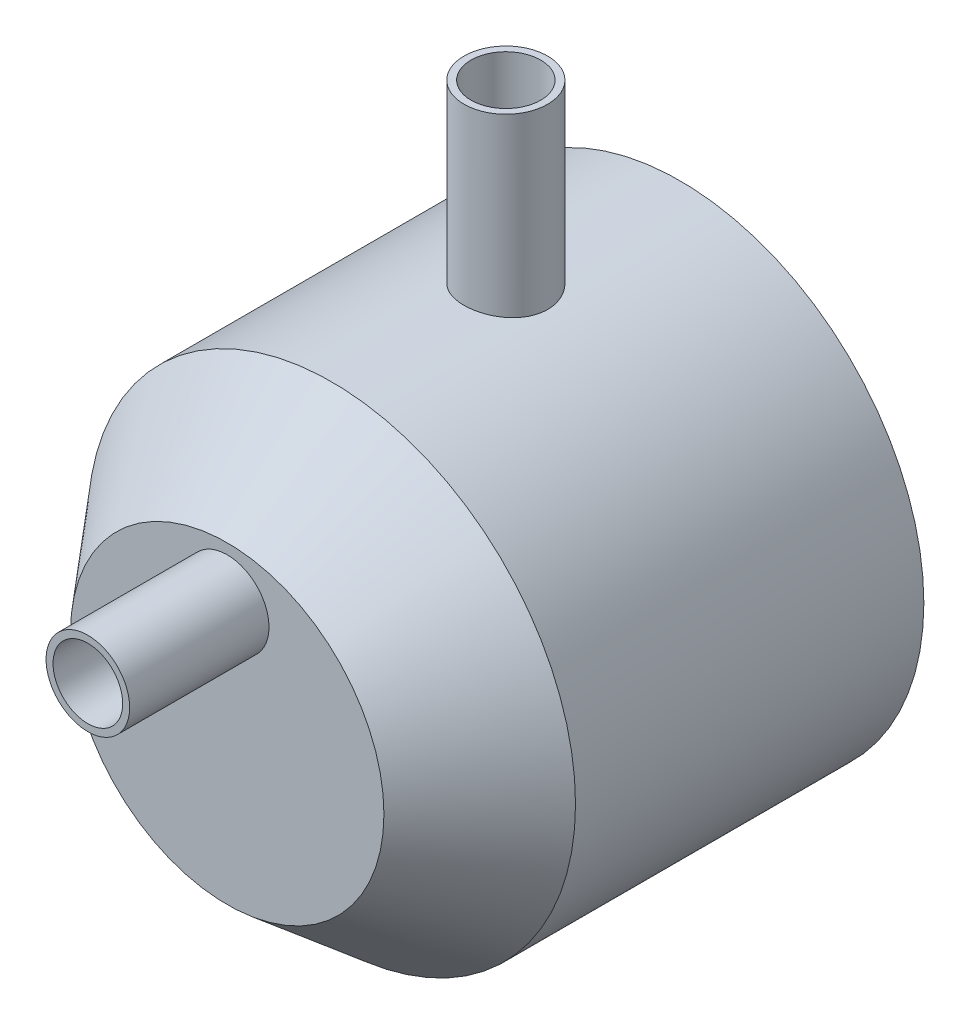
ISO-10303-21;
HEADER;
FILE_DESCRIPTION(('STEP AP214'),'2;1');
FILE_NAME('part.step','',(''),(''),'','','');
FILE_SCHEMA(('AUTOMOTIVE_DESIGN { 1 0 10303 214 1 1 1 1 }'));
ENDSEC;
DATA;
#1=APPLICATION_CONTEXT('core data for automotive mechanical design processes');
#2=APPLICATION_PROTOCOL_DEFINITION('international standard','automotive_design',2000,#1);
#3=PRODUCT_CONTEXT('',#1,'mechanical');
#4=PRODUCT('Part','Part','',(#3));
#5=PRODUCT_RELATED_PRODUCT_CATEGORY('part','',(#4));
#6=PRODUCT_DEFINITION_FORMATION('','',#4);
#7=PRODUCT_DEFINITION_CONTEXT('part definition',#1,'design');
#8=PRODUCT_DEFINITION('design','',#6,#7);
#9=PRODUCT_DEFINITION_SHAPE('','',#8);
#10=(LENGTH_UNIT() NAMED_UNIT(*) SI_UNIT(.MILLI.,.METRE.));
#11=(NAMED_UNIT(*) PLANE_ANGLE_UNIT() SI_UNIT($,.RADIAN.));
#12=(NAMED_UNIT(*) SI_UNIT($,.STERADIAN.) SOLID_ANGLE_UNIT());
#13=UNCERTAINTY_MEASURE_WITH_UNIT(LENGTH_MEASURE(1.E-05),#10,'distance_accuracy_value','');
#14=(GEOMETRIC_REPRESENTATION_CONTEXT(3) GLOBAL_UNCERTAINTY_ASSIGNED_CONTEXT((#13)) GLOBAL_UNIT_ASSIGNED_CONTEXT((#10,
#11,#12)) REPRESENTATION_CONTEXT('',''));
#15=CARTESIAN_POINT('',(0.,0.,0.));
#16=DIRECTION('',(0.,0.,1.));
#17=DIRECTION('',(1.,0.,0.));
#18=AXIS2_PLACEMENT_3D('',#15,#16,#17);
#19=CARTESIAN_POINT('',(0.,0.,-25.));
#20=DIRECTION('',(0.,0.,1.));
#21=DIRECTION('',(1.,0.,0.));
#22=AXIS2_PLACEMENT_3D('',#19,#20,#21);
#23=PLANE('',#22);
#24=CARTESIAN_POINT('',(0.,28.75,-25.));
#25=DIRECTION('',(0.,0.,-1.));
#26=DIRECTION('',(-1.,0.,0.));
#27=AXIS2_PLACEMENT_3D('',#24,#25,#26);
#28=CIRCLE('',#27,1.5);
#29=CARTESIAN_POINT('',(-1.5,28.75,-25.));
#30=VERTEX_POINT('',#29);
#31=EDGE_CURVE('E246',#30,#30,#28,.T.);
#32=ORIENTED_EDGE('',*,*,#31,.F.);
#33=EDGE_LOOP('',(#32));
#34=FACE_BOUND('',#33,.T.);
#35=CARTESIAN_POINT('',(-28.75,-1.0038008849174E-13,-25.));
#36=DIRECTION('',(0.,0.,-1.));
#37=DIRECTION('',(-1.,0.,0.));
#38=AXIS2_PLACEMENT_3D('',#35,#36,#37);
#39=CIRCLE('',#38,1.5);
#40=CARTESIAN_POINT('',(-30.25,-1.0038008849174E-13,-25.));
#41=VERTEX_POINT('',#40);
#42=EDGE_CURVE('E240',#41,#41,#39,.T.);
#43=ORIENTED_EDGE('',*,*,#42,.F.);
#44=EDGE_LOOP('',(#43));
#45=FACE_BOUND('',#44,.T.);
#46=CARTESIAN_POINT('',(2.0076017698348E-13,-28.75,-25.));
#47=DIRECTION('',(0.,0.,-1.));
#48=DIRECTION('',(-1.,0.,0.));
#49=AXIS2_PLACEMENT_3D('',#46,#47,#48);
#50=CIRCLE('',#49,1.5);
#51=CARTESIAN_POINT('',(-1.4999999999998,-28.75,-25.));
#52=VERTEX_POINT('',#51);
#53=EDGE_CURVE('E234',#52,#52,#50,.T.);
#54=ORIENTED_EDGE('',*,*,#53,.F.);
#55=EDGE_LOOP('',(#54));
#56=FACE_BOUND('',#55,.T.);
#57=CARTESIAN_POINT('',(28.75,0.,-25.));
#58=DIRECTION('',(0.,0.,-1.));
#59=DIRECTION('',(-1.,0.,0.));
#60=AXIS2_PLACEMENT_3D('',#57,#58,#59);
#61=CIRCLE('',#60,1.50000000000029);
#62=CARTESIAN_POINT('',(27.2499999999997,0.,-25.));
#63=VERTEX_POINT('',#62);
#64=EDGE_CURVE('E228',#63,#63,#61,.T.);
#65=ORIENTED_EDGE('',*,*,#64,.F.);
#66=EDGE_LOOP('',(#65));
#67=FACE_BOUND('',#66,.T.);
#68=CARTESIAN_POINT('',(0.,0.,-25.));
#69=DIRECTION('',(0.,0.,1.));
#70=DIRECTION('',(1.,0.,0.));
#71=AXIS2_PLACEMENT_3D('',#68,#69,#70);
#72=CIRCLE('',#71,35.);
#73=CARTESIAN_POINT('',(35.,0.,-25.));
#74=VERTEX_POINT('',#73);
#75=EDGE_CURVE('E57',#74,#74,#72,.T.);
#76=ORIENTED_EDGE('',*,*,#75,.F.);
#77=EDGE_LOOP('',(#76));
#78=FACE_BOUND('',#77,.T.);
#79=CARTESIAN_POINT('',(0.,0.,-25.));
#80=DIRECTION('',(0.,0.,1.));
#81=DIRECTION('',(1.,0.,0.));
#82=AXIS2_PLACEMENT_3D('',#79,#80,#81);
#83=CIRCLE('',#82,25.);
#84=CARTESIAN_POINT('',(25.,0.,-25.));
#85=VERTEX_POINT('',#84);
#86=EDGE_CURVE('E224',#85,#85,#83,.T.);
#87=ORIENTED_EDGE('',*,*,#86,.T.);
#88=EDGE_LOOP('',(#87));
#89=FACE_BOUND('',#88,.T.);
#90=ADVANCED_FACE('F41',(#34,#45,#56,#67,#78,#89),#23,.F.);
#91=CARTESIAN_POINT('',(0.,0.,25.));
#92=DIRECTION('',(0.,0.,-1.));
#93=DIRECTION('',(-1.,0.,0.));
#94=AXIS2_PLACEMENT_3D('',#91,#92,#93);
#95=CYLINDRICAL_SURFACE('',#94,35.);
#96=CARTESIAN_POINT('',(0.,35.,6.));
#97=CARTESIAN_POINT('',(0.167255087471428,35.0000011902094,6.00000267119796));
#98=CARTESIAN_POINT('',(0.334474390584254,34.9987988996139,5.99300431247895));
#99=CARTESIAN_POINT('',(0.667761983511847,34.9940258915101,5.96506920485906));
#100=CARTESIAN_POINT('',(0.83383004354154,34.9904547141925,5.94412974993866));
#101=CARTESIAN_POINT('',(1.16367070121942,34.9810394161034,5.88845199675508));
#102=CARTESIAN_POINT('',(1.32744182099786,34.9751938957832,5.85370520167074));
#103=CARTESIAN_POINT('',(1.6514864091043,34.9613915699314,5.77066517278663));
#104=CARTESIAN_POINT('',(1.81175857044868,34.9534339895959,5.72236696731272));
#105=CARTESIAN_POINT('',(2.12742268084538,34.9356413448036,5.61266065102139));
#106=CARTESIAN_POINT('',(2.28282033245156,34.9258085773321,5.55126856859272));
#107=CARTESIAN_POINT('',(2.58792139207819,34.904527774849,5.41576726871657));
#108=CARTESIAN_POINT('',(2.73762267652667,34.8930791448,5.34165336430708));
#109=CARTESIAN_POINT('',(3.03017581285948,34.8688911584513,5.18129777081694));
#110=CARTESIAN_POINT('',(3.1730309814093,34.8561524366543,5.09506203556884));
#111=CARTESIAN_POINT('',(3.45105732212438,34.8297245697617,4.91100882922026));
#112=CARTESIAN_POINT('',(3.58622560796193,34.8160350718917,4.81318704965451));
#113=CARTESIAN_POINT('',(3.84904873968708,34.7879640713622,4.6057671097983));
#114=CARTESIAN_POINT('',(3.97662830563843,34.7735775990623,4.49607422398153));
#115=CARTESIAN_POINT('',(4.22216337106758,34.7446201267743,4.26633497931929));
#116=CARTESIAN_POINT('',(4.34011528953941,34.7300490604333,4.14628480191984));
#117=CARTESIAN_POINT('',(4.56549997194578,34.701140018335,3.89672563057276));
#118=CARTESIAN_POINT('',(4.67293590168903,34.6868019735181,3.76721950393765));
#119=CARTESIAN_POINT('',(4.87662179925916,34.6587526621056,3.49955059841634));
#120=CARTESIAN_POINT('',(4.97286762693305,34.6450416286249,3.36138464445166));
#121=CARTESIAN_POINT('',(5.15400759981013,34.6185591911399,3.07650314557424));
#122=CARTESIAN_POINT('',(5.23882786309838,34.60579412236,2.9297400123547));
#123=CARTESIAN_POINT('',(5.39582022456368,34.5816632673698,2.62942000147356));
#124=CARTESIAN_POINT('',(5.46798759523201,34.5702980046398,2.47586061124641));
#125=CARTESIAN_POINT('',(5.59906873495057,34.5493103878907,2.16313326719432));
#126=CARTESIAN_POINT('',(5.65798814494934,34.5396872924026,2.00396773397012));
#127=CARTESIAN_POINT('',(5.76217911459162,34.5224570396302,1.68110754367073));
#128=CARTESIAN_POINT('',(5.80744569543277,34.5148506178921,1.51741125805874));
#129=CARTESIAN_POINT('',(5.92138281112091,34.4955569237882,1.02462432028316));
#130=CARTESIAN_POINT('',(5.96962059436966,34.4871581539253,0.690410413643021));
#131=CARTESIAN_POINT('',(6.00940841614288,34.4802462047373,0.0187185886917149));
#132=CARTESIAN_POINT('',(6.00096269894606,34.4817322852663,-0.318759083349711));
#133=CARTESIAN_POINT('',(5.928142047883,34.4943248712133,-0.983728795102239));
#134=CARTESIAN_POINT('',(5.86437937461099,34.5053260572642,-1.3112896584949));
#135=CARTESIAN_POINT('',(5.68367618630603,34.5355488861116,-1.95098144684875));
#136=CARTESIAN_POINT('',(5.56673375127239,34.5547708257084,-2.26311181425658));
#137=CARTESIAN_POINT('',(5.28237988920625,34.5993811298225,-2.86492251090354));
#138=CARTESIAN_POINT('',(5.11471569302312,34.6248002515789,-3.15448104851771));
#139=CARTESIAN_POINT('',(4.73385555217443,34.6789200271994,-3.70158520204602));
#140=CARTESIAN_POINT('',(4.52065572477878,34.7076209607999,-3.95912808508634));
#141=CARTESIAN_POINT('',(4.05144742166874,34.7655325140833,-4.43843504047085));
#142=CARTESIAN_POINT('',(3.79491383202591,34.7947448793596,-4.65968517595035));
#143=CARTESIAN_POINT('',(3.24809177643702,34.8500400800064,-5.05607892159695));
#144=CARTESIAN_POINT('',(2.95780306898345,34.8761228929832,-5.2312222018544));
#145=CARTESIAN_POINT('',(2.35121626632627,34.9222604233032,-5.53048369307316));
#146=CARTESIAN_POINT('',(2.03489445505043,34.9423095648186,-5.65455474594029));
#147=CARTESIAN_POINT('',(1.38548169006878,34.9740764048676,-5.84766360662485));
#148=CARTESIAN_POINT('',(1.05239222433856,34.9857948412842,-5.91670628858489));
#149=CARTESIAN_POINT('',(0.383327241736948,34.999480233491,-5.99709776981965));
#150=CARTESIAN_POINT('',(0.047438816180659,35.0015663808641,-6.00915180132078));
#151=CARTESIAN_POINT('',(-0.621557180969552,34.9960792088544,-5.97710650158018));
#152=CARTESIAN_POINT('',(-0.954664865430544,34.9885062834599,-5.93300946070997));
#153=CARTESIAN_POINT('',(-1.60645253609048,34.9646257483422,-5.79050034100857));
#154=CARTESIAN_POINT('',(-1.92521147659127,34.9483745778773,-5.69243909577543));
#155=CARTESIAN_POINT('',(-2.54176506024792,34.9089523152303,-5.44516031439114));
#156=CARTESIAN_POINT('',(-2.83955846889818,34.8857808159814,-5.29593976887759));
#157=CARTESIAN_POINT('',(-3.40877939224365,34.8347920653134,-4.94897524031828));
#158=CARTESIAN_POINT('',(-3.67993589975609,34.8069336061326,-4.75079282625198));
#159=CARTESIAN_POINT('',(-4.18539502869112,34.7497811627948,-4.31212995771306));
#160=CARTESIAN_POINT('',(-4.41969480526196,34.7204870680543,-4.07164624117151));
#161=CARTESIAN_POINT('',(-4.84741854940676,34.6633771820772,-3.55204207077538));
#162=CARTESIAN_POINT('',(-5.0403649495852,34.6355811775457,-3.27252601330165));
#163=CARTESIAN_POINT('',(-5.37656320247135,34.5849909667226,-2.6846216160189));
#164=CARTESIAN_POINT('',(-5.51981669519885,34.5621965953707,-2.37623422947977));
#165=CARTESIAN_POINT('',(-5.75186205052635,34.5243379675097,-1.74071365071897));
#166=CARTESIAN_POINT('',(-5.84088747754122,34.5092406059138,-1.41366758338266));
#167=CARTESIAN_POINT('',(-5.96266101932707,34.4884132879114,-0.748794651745602));
#168=CARTESIAN_POINT('',(-5.99541433952048,34.4826824650603,-0.41096878756952));
#169=CARTESIAN_POINT('',(-6.00159891647544,34.4815984876319,0.0937174166359943));
#170=CARTESIAN_POINT('',(-5.9966630087259,34.4824611974773,0.260578316821595));
#171=CARTESIAN_POINT('',(-5.97292151716282,34.4865829183128,0.593263774500498));
#172=CARTESIAN_POINT('',(-5.95412115115363,34.4898410278075,0.759088698206944));
#173=CARTESIAN_POINT('',(-5.90278019779035,34.4986644685933,1.08858292214529));
#174=CARTESIAN_POINT('',(-5.87023471601847,34.5042306217294,1.25225143308437));
#175=CARTESIAN_POINT('',(-5.79166976313164,34.5175049687505,1.57617285020332));
#176=CARTESIAN_POINT('',(-5.74565513610598,34.5252123924911,1.73642696215924));
#177=CARTESIAN_POINT('',(-5.64054285218009,34.5425405417209,2.05230572742614));
#178=CARTESIAN_POINT('',(-5.58145776436293,34.5521594281728,2.2079346664875));
#179=CARTESIAN_POINT('',(-5.45063686203589,34.5730377734228,2.51359984654499));
#180=CARTESIAN_POINT('',(-5.37890557151232,34.5842966452917,2.66363806436288));
#181=CARTESIAN_POINT('',(-5.22326103117158,34.6081455971321,2.9572215970771));
#182=CARTESIAN_POINT('',(-5.13934296703916,34.6207362026609,3.10076431643319));
#183=CARTESIAN_POINT('',(-4.95996627162299,34.6468893731251,3.38028134802724));
#184=CARTESIAN_POINT('',(-4.86451168420885,34.6604515968065,3.51625828801254));
#185=CARTESIAN_POINT('',(-4.66138804509833,34.688356871547,3.78149745816822));
#186=CARTESIAN_POINT('',(-4.55357712344585,34.702707746692,3.91065024352494));
#187=CARTESIAN_POINT('',(-4.327549159864,34.7316180291512,4.15939287551297));
#188=CARTESIAN_POINT('',(-4.20933583990684,34.7461773603313,4.27898611355196));
#189=CARTESIAN_POINT('',(-3.96320522431521,34.7751112681018,4.5079116645694));
#190=CARTESIAN_POINT('',(-3.83528218948524,34.7894857294573,4.61723782214721));
#191=CARTESIAN_POINT('',(-3.57071599823459,34.817634530251,4.82475300855758));
#192=CARTESIAN_POINT('',(-3.43407607698941,34.8314090891792,4.92294613214544));
#193=CARTESIAN_POINT('',(-3.15187580995356,34.858082506455,5.10826712540411));
#194=CARTESIAN_POINT('',(-3.00625457426991,34.8709737566258,5.19530340909114));
#195=CARTESIAN_POINT('',(-2.70813322394742,34.8953918653276,5.35674720177555));
#196=CARTESIAN_POINT('',(-2.55563566697777,34.9069192254737,5.43115935810344));
#197=CARTESIAN_POINT('',(-2.24488730323672,34.9282794883191,5.56679405306316));
#198=CARTESIAN_POINT('',(-2.08664050995266,34.938113546582,5.6280255937646));
#199=CARTESIAN_POINT('',(-1.76548316359966,34.9558142525876,5.73688281762534));
#200=CARTESIAN_POINT('',(-1.60257360589892,34.963681316788,5.78451138115076));
#201=CARTESIAN_POINT('',(-1.20307991059687,34.9801044005818,5.88311436717536));
#202=CARTESIAN_POINT('',(-0.964634829229578,34.9875299049284,5.92689342639257));
#203=CARTESIAN_POINT('',(-0.484101478526038,34.997476797315,5.985334035788));
#204=CARTESIAN_POINT('',(-0.242013277953379,34.9999982778014,5.99999613485375));
#205=CARTESIAN_POINT('',(0.,35.,6.));
#206=B_SPLINE_CURVE_WITH_KNOTS('',3,(#96,#97,#98,#99,#100,#101,#102,#103,#104,#105,#106,#107,
#108,#109,#110,#111,#112,#113,#114,#115,#116,#117,#118,#119,#120,#121,#122,#123,#124,#125,#126,
#127,#128,#129,#130,#131,#132,#133,#134,#135,#136,#137,#138,#139,#140,#141,#142,#143,#144,#145,
#146,#147,#148,#149,#150,#151,#152,#153,#154,#155,#156,#157,#158,#159,#160,#161,#162,#163,#164,
#165,#166,#167,#168,#169,#170,#171,#172,#173,#174,#175,#176,#177,#178,#179,#180,#181,#182,#183,
#184,#185,#186,#187,#188,#189,#190,#191,#192,#193,#194,#195,#196,#197,#198,#199,#200,#201,#202,
#203,#204,#205),.UNSPECIFIED.,.T.,.F.,(4,2,2,2,2,2,2,2,2,2,2,2,2,2,2,2,2,2,2,2,2,2,2,2,2,2,2,2,
2,2,2,2,2,2,2,2,2,2,2,2,2,2,2,2,2,2,2,2,2,2,2,2,2,2,4),(0.,0.501553083053311,1.00320354785158,
1.50516319976709,2.00730724948681,2.50884011017756,3.01055814329274,3.51203060502584,
4.01369013669868,4.51969793483492,5.02589309308951,5.5319353909816,6.03816432434856,
6.54752387800066,7.05707334030693,7.56640542511763,8.07592302504638,9.08394479611769,
10.0918910905938,11.0888215148139,12.0857879350411,13.0878068985843,14.0899113363684,
15.1051677868531,16.1204315016331,17.1366305796115,18.1527396376645,19.1562408828585,
20.1597011970972,21.1567135634395,22.1537845874734,23.16012987886,24.1665528087079,
25.1840372778368,26.2014881636331,27.214525239611,28.2274686000663,28.7277890689093,
29.2279213412229,29.7282318530616,30.2283626521353,30.7280145799376,31.227488126233,
31.7271595261716,32.2266562827379,32.7326061770832,33.2383757732468,33.7444466820717,
34.2503308488655,34.7601329066642,35.2697468814403,35.7790116889688,36.2881685819984,
37.0139150797248,37.7396478961815),.UNSPECIFIED.);
#207=CARTESIAN_POINT('',(0.,35.,6.));
#208=VERTEX_POINT('',#207);
#209=EDGE_CURVE('E90',#208,#208,#206,.T.);
#210=ORIENTED_EDGE('',*,*,#209,.F.);
#211=EDGE_LOOP('',(#210));
#212=FACE_BOUND('',#211,.T.);
#213=CARTESIAN_POINT('',(0.,0.,25.));
#214=DIRECTION('',(0.,0.,-1.));
#215=DIRECTION('',(-1.,0.,0.));
#216=AXIS2_PLACEMENT_3D('',#213,#214,#215);
#217=CIRCLE('',#216,35.);
#218=CARTESIAN_POINT('',(-35.,0.,25.));
#219=VERTEX_POINT('',#218);
#220=EDGE_CURVE('E53',#219,#219,#217,.F.);
#221=ORIENTED_EDGE('',*,*,#220,.F.);
#222=EDGE_LOOP('',(#221));
#223=FACE_BOUND('',#222,.T.);
#224=ORIENTED_EDGE('',*,*,#75,.T.);
#225=EDGE_LOOP('',(#224));
#226=FACE_BOUND('',#225,.T.);
#227=ADVANCED_FACE('F43',(#212,#223,#226),#95,.T.);
#228=CARTESIAN_POINT('',(0.,0.,25.));
#229=DIRECTION('',(0.,0.,-1.));
#230=DIRECTION('',(-1.,0.,0.));
#231=AXIS2_PLACEMENT_3D('',#228,#229,#230);
#232=CYLINDRICAL_SURFACE('',#231,25.);
#233=CARTESIAN_POINT('',(0.,0.,25.));
#234=DIRECTION('',(0.,0.,-1.));
#235=DIRECTION('',(-1.,0.,0.));
#236=AXIS2_PLACEMENT_3D('',#233,#234,#235);
#237=CIRCLE('',#236,25.);
#238=CARTESIAN_POINT('',(-12.9148276581861,21.4057755421137,25.));
#239=VERTEX_POINT('',#238);
#240=EDGE_CURVE('E64',#239,#239,#237,.T.);
#241=ORIENTED_EDGE('',*,*,#240,.F.);
#242=EDGE_LOOP('',(#241));
#243=FACE_BOUND('',#242,.T.);
#244=ORIENTED_EDGE('',*,*,#86,.F.);
#245=EDGE_LOOP('',(#244));
#246=FACE_BOUND('',#245,.T.);
#247=ADVANCED_FACE('F205',(#243,#246),#232,.F.);
#248=CARTESIAN_POINT('',(28.75,0.,-15.));
#249=DIRECTION('',(0.,0.,-1.));
#250=DIRECTION('',(-1.,0.,0.));
#251=AXIS2_PLACEMENT_3D('',#248,#249,#250);
#252=CYLINDRICAL_SURFACE('',#251,1.50000000000029);
#253=CARTESIAN_POINT('',(28.75,0.,-15.));
#254=DIRECTION('',(0.,0.,-1.));
#255=DIRECTION('',(-1.,0.,0.));
#256=AXIS2_PLACEMENT_3D('',#253,#254,#255);
#257=CIRCLE('',#256,1.50000000000029);
#258=CARTESIAN_POINT('',(27.2499999999997,0.,-15.));
#259=VERTEX_POINT('',#258);
#260=EDGE_CURVE('E231',#259,#259,#257,.T.);
#261=ORIENTED_EDGE('',*,*,#260,.F.);
#262=EDGE_LOOP('',(#261));
#263=FACE_BOUND('',#262,.T.);
#264=ORIENTED_EDGE('',*,*,#64,.T.);
#265=EDGE_LOOP('',(#264));
#266=FACE_BOUND('',#265,.T.);
#267=ADVANCED_FACE('F201',(#263,#266),#252,.F.);
#268=CARTESIAN_POINT('',(28.75,0.,-15.));
#269=DIRECTION('',(0.,0.,-1.));
#270=DIRECTION('',(-1.,0.,0.));
#271=AXIS2_PLACEMENT_3D('',#268,#269,#270);
#272=PLANE('',#271);
#273=ORIENTED_EDGE('',*,*,#260,.T.);
#274=EDGE_LOOP('',(#273));
#275=FACE_BOUND('',#274,.T.);
#276=ADVANCED_FACE('F197',(#275),#272,.T.);
#277=CARTESIAN_POINT('',(2.0076017698348E-13,-28.75,-15.));
#278=DIRECTION('',(0.,0.,-1.));
#279=DIRECTION('',(-1.,0.,0.));
#280=AXIS2_PLACEMENT_3D('',#277,#278,#279);
#281=CYLINDRICAL_SURFACE('',#280,1.5);
#282=CARTESIAN_POINT('',(2.0076017698348E-13,-28.75,-15.));
#283=DIRECTION('',(0.,0.,-1.));
#284=DIRECTION('',(-1.,0.,0.));
#285=AXIS2_PLACEMENT_3D('',#282,#283,#284);
#286=CIRCLE('',#285,1.5);
#287=CARTESIAN_POINT('',(-1.4999999999998,-28.75,-15.));
#288=VERTEX_POINT('',#287);
#289=EDGE_CURVE('E237',#288,#288,#286,.T.);
#290=ORIENTED_EDGE('',*,*,#289,.F.);
#291=EDGE_LOOP('',(#290));
#292=FACE_BOUND('',#291,.T.);
#293=ORIENTED_EDGE('',*,*,#53,.T.);
#294=EDGE_LOOP('',(#293));
#295=FACE_BOUND('',#294,.T.);
#296=ADVANCED_FACE('F193',(#292,#295),#281,.F.);
#297=CARTESIAN_POINT('',(2.0076017698348E-13,-28.75,-15.));
#298=DIRECTION('',(0.,0.,-1.));
#299=DIRECTION('',(-1.,0.,0.));
#300=AXIS2_PLACEMENT_3D('',#297,#298,#299);
#301=PLANE('',#300);
#302=ORIENTED_EDGE('',*,*,#289,.T.);
#303=EDGE_LOOP('',(#302));
#304=FACE_BOUND('',#303,.T.);
#305=ADVANCED_FACE('F189',(#304),#301,.T.);
#306=CARTESIAN_POINT('',(-28.75,-1.0038008849174E-13,-15.));
#307=DIRECTION('',(0.,0.,-1.));
#308=DIRECTION('',(-1.,0.,0.));
#309=AXIS2_PLACEMENT_3D('',#306,#307,#308);
#310=CYLINDRICAL_SURFACE('',#309,1.5);
#311=CARTESIAN_POINT('',(-28.75,-1.0038008849174E-13,-15.));
#312=DIRECTION('',(0.,0.,-1.));
#313=DIRECTION('',(-1.,0.,0.));
#314=AXIS2_PLACEMENT_3D('',#311,#312,#313);
#315=CIRCLE('',#314,1.5);
#316=CARTESIAN_POINT('',(-30.25,-1.0038008849174E-13,-15.));
#317=VERTEX_POINT('',#316);
#318=EDGE_CURVE('E243',#317,#317,#315,.T.);
#319=ORIENTED_EDGE('',*,*,#318,.F.);
#320=EDGE_LOOP('',(#319));
#321=FACE_BOUND('',#320,.T.);
#322=ORIENTED_EDGE('',*,*,#42,.T.);
#323=EDGE_LOOP('',(#322));
#324=FACE_BOUND('',#323,.T.);
#325=ADVANCED_FACE('F185',(#321,#324),#310,.F.);
#326=CARTESIAN_POINT('',(-28.75,-1.0038008849174E-13,-15.));
#327=DIRECTION('',(0.,0.,-1.));
#328=DIRECTION('',(-1.,0.,0.));
#329=AXIS2_PLACEMENT_3D('',#326,#327,#328);
#330=PLANE('',#329);
#331=ORIENTED_EDGE('',*,*,#318,.T.);
#332=EDGE_LOOP('',(#331));
#333=FACE_BOUND('',#332,.T.);
#334=ADVANCED_FACE('F181',(#333),#330,.T.);
#335=CARTESIAN_POINT('',(0.,28.75,-15.));
#336=DIRECTION('',(0.,0.,-1.));
#337=DIRECTION('',(-1.,0.,0.));
#338=AXIS2_PLACEMENT_3D('',#335,#336,#337);
#339=CYLINDRICAL_SURFACE('',#338,1.5);
#340=CARTESIAN_POINT('',(0.,28.75,-15.));
#341=DIRECTION('',(0.,0.,-1.));
#342=DIRECTION('',(-1.,0.,0.));
#343=AXIS2_PLACEMENT_3D('',#340,#341,#342);
#344=CIRCLE('',#343,1.5);
#345=CARTESIAN_POINT('',(-1.5,28.75,-15.));
#346=VERTEX_POINT('',#345);
#347=EDGE_CURVE('E227',#346,#346,#344,.T.);
#348=ORIENTED_EDGE('',*,*,#347,.F.);
#349=EDGE_LOOP('',(#348));
#350=FACE_BOUND('',#349,.T.);
#351=ORIENTED_EDGE('',*,*,#31,.T.);
#352=EDGE_LOOP('',(#351));
#353=FACE_BOUND('',#352,.T.);
#354=ADVANCED_FACE('F177',(#350,#353),#339,.F.);
#355=CARTESIAN_POINT('',(0.,28.75,-15.));
#356=DIRECTION('',(0.,0.,-1.));
#357=DIRECTION('',(-1.,0.,0.));
#358=AXIS2_PLACEMENT_3D('',#355,#356,#357);
#359=PLANE('',#358);
#360=ORIENTED_EDGE('',*,*,#347,.T.);
#361=EDGE_LOOP('',(#360));
#362=FACE_BOUND('',#361,.T.);
#363=ADVANCED_FACE('F174',(#362),#359,.T.);
#364=CARTESIAN_POINT('',(0.,0.,40.));
#365=DIRECTION('',(0.,0.,1.));
#366=DIRECTION('',(1.,0.,0.));
#367=AXIS2_PLACEMENT_3D('',#364,#365,#366);
#368=PLANE('',#367);
#369=CARTESIAN_POINT('',(0.,15.,40.));
#370=DIRECTION('',(0.,0.,1.));
#371=DIRECTION('',(1.,0.,0.));
#372=AXIS2_PLACEMENT_3D('',#369,#370,#371);
#373=CIRCLE('',#372,6.);
#374=CARTESIAN_POINT('',(6.,15.,40.));
#375=VERTEX_POINT('',#374);
#376=EDGE_CURVE('E11',#375,#375,#373,.T.);
#377=ORIENTED_EDGE('',*,*,#376,.F.);
#378=EDGE_LOOP('',(#377));
#379=FACE_BOUND('',#378,.T.);
#380=CARTESIAN_POINT('',(0.,0.,40.));
#381=DIRECTION('',(0.,0.,1.));
#382=DIRECTION('',(1.,0.,0.));
#383=AXIS2_PLACEMENT_3D('',#380,#381,#382);
#384=CIRCLE('',#383,22.5);
#385=CARTESIAN_POINT('',(22.5,0.,40.));
#386=VERTEX_POINT('',#385);
#387=EDGE_CURVE('E160',#386,#386,#384,.T.);
#388=ORIENTED_EDGE('',*,*,#387,.T.);
#389=EDGE_LOOP('',(#388));
#390=FACE_BOUND('',#389,.T.);
#391=ADVANCED_FACE('F125',(#379,#390),#368,.T.);
#392=CARTESIAN_POINT('',(0.,0.,40.));
#393=DIRECTION('',(0.,0.,-1.));
#394=DIRECTION('',(-1.,0.,0.));
#395=AXIS2_PLACEMENT_3D('',#392,#393,#394);
#396=CONICAL_SURFACE('',#395,22.5,0.694738276196703);
#397=ORIENTED_EDGE('',*,*,#387,.F.);
#398=EDGE_LOOP('',(#397));
#399=FACE_BOUND('',#398,.T.);
#400=ORIENTED_EDGE('',*,*,#220,.T.);
#401=EDGE_LOOP('',(#400));
#402=FACE_BOUND('',#401,.T.);
#403=ADVANCED_FACE('F165',(#399,#402),#396,.T.);
#404=CARTESIAN_POINT('',(0.,0.,37.));
#405=DIRECTION('',(0.,0.,1.));
#406=DIRECTION('',(1.,0.,0.));
#407=AXIS2_PLACEMENT_3D('',#404,#405,#406);
#408=PLANE('',#407);
#409=CARTESIAN_POINT('',(0.,0.,37.));
#410=DIRECTION('',(0.,0.,1.));
#411=DIRECTION('',(1.,0.,0.));
#412=AXIS2_PLACEMENT_3D('',#409,#410,#411);
#413=CIRCLE('',#412,19.);
#414=CARTESIAN_POINT('',(-17.413546016231,7.60055360750805,37.));
#415=VERTEX_POINT('',#414);
#416=EDGE_CURVE('E97',#415,#415,#413,.T.);
#417=ORIENTED_EDGE('',*,*,#416,.F.);
#418=EDGE_LOOP('',(#417));
#419=FACE_BOUND('',#418,.T.);
#420=ADVANCED_FACE('F86',(#419),#408,.F.);
#421=CARTESIAN_POINT('',(-17.413546016231,7.60055360750805,37.));
#422=CARTESIAN_POINT('',(-12.9148276581861,21.4057755421137,25.));
#423=CARTESIAN_POINT('',(-2.21243880121495,42.4276456399701,37.));
#424=CARTESIAN_POINT('',(29.8967234260412,47.2354308584859,25.));
#425=CARTESIAN_POINT('',(32.6146532312472,27.226538424954,37.));
#426=CARTESIAN_POINT('',(55.7263787424134,4.42387977425853,25.));
#427=CARTESIAN_POINT('',(17.413546016231,-7.60055360750805,37.));
#428=CARTESIAN_POINT('',(12.9148276581861,-21.4057755421137,25.));
#429=CARTESIAN_POINT('',(2.21243880121496,-42.4276456399701,37.));
#430=CARTESIAN_POINT('',(-29.8967234260412,-47.2354308584859,25.));
#431=CARTESIAN_POINT('',(-32.6146532312471,-27.226538424954,37.));
#432=CARTESIAN_POINT('',(-55.7263787424134,-4.42387977425852,25.));
#433=CARTESIAN_POINT('',(-17.413546016231,7.60055360750805,37.));
#434=CARTESIAN_POINT('',(-12.9148276581861,21.4057755421137,25.));
#435=(BOUNDED_SURFACE() B_SPLINE_SURFACE(3,1,((#421,#422),(#423,#424),(#425,#426),(#427,#428),
(#429,#430),(#431,#432),(#433,#434)),.UNSPECIFIED.,.T.,.F.,.F.) B_SPLINE_SURFACE_WITH_KNOTS((4,
3,4),(2,2),(0.,0.5,1.),(0.,1.),
.UNSPECIFIED.) GEOMETRIC_REPRESENTATION_ITEM() RATIONAL_B_SPLINE_SURFACE(((1.,1.),
(0.333333333333333,0.333333333333333),(0.333333333333333,0.333333333333333),(1.,1.),
(0.333333333333334,0.333333333333333),(0.333333333333334,0.333333333333333),(1.,1.))) REPRESENTATION_ITEM('') SURFACE());
#436=CARTESIAN_POINT('',(-17.413546016231,7.60055360750805,37.));
#437=CARTESIAN_POINT('',(-17.3666843666681,7.74435800266019,36.875));
#438=CARTESIAN_POINT('',(-17.3198227171051,7.88816239781233,36.75));
#439=CARTESIAN_POINT('',(-17.2260994179792,8.17577118811662,36.5));
#440=CARTESIAN_POINT('',(-17.1792377684162,8.31957558326876,36.375));
#441=CARTESIAN_POINT('',(-17.0855144692903,8.60718437357304,36.125));
#442=CARTESIAN_POINT('',(-17.0386528197273,8.75098876872518,36.));
#443=CARTESIAN_POINT('',(-16.9449295206014,9.03859755902947,35.75));
#444=CARTESIAN_POINT('',(-16.8980678710384,9.18240195418161,35.625));
#445=CARTESIAN_POINT('',(-16.8043445719125,9.4700107444859,35.375));
#446=CARTESIAN_POINT('',(-16.7574829223495,9.61381513963804,35.25));
#447=CARTESIAN_POINT('',(-16.6637596232236,9.90142392994232,35.));
#448=CARTESIAN_POINT('',(-16.6168979736606,10.0452283250945,34.875));
#449=CARTESIAN_POINT('',(-16.5231746745347,10.3328371153987,34.625));
#450=CARTESIAN_POINT('',(-16.4763130249717,10.4766415105509,34.5));
#451=CARTESIAN_POINT('',(-16.3825897258458,10.7642503008552,34.25));
#452=CARTESIAN_POINT('',(-16.3357280762828,10.9080546960073,34.125));
#453=CARTESIAN_POINT('',(-16.2420047771568,11.1956634863116,33.875));
#454=CARTESIAN_POINT('',(-16.1951431275939,11.3394678814637,33.75));
#455=CARTESIAN_POINT('',(-16.1014198284679,11.627076671768,33.5));
#456=CARTESIAN_POINT('',(-16.054558178905,11.7708810669202,33.375));
#457=CARTESIAN_POINT('',(-15.960834879779,12.0584898572244,33.125));
#458=CARTESIAN_POINT('',(-15.9139732302161,12.2022942523766,33.));
#459=CARTESIAN_POINT('',(-15.8202499310901,12.4899030426809,32.75));
#460=CARTESIAN_POINT('',(-15.7733882815272,12.633707437833,32.625));
#461=CARTESIAN_POINT('',(-15.6796649824012,12.9213162281373,32.375));
#462=CARTESIAN_POINT('',(-15.6328033328383,13.0651206232894,32.25));
#463=CARTESIAN_POINT('',(-15.5390800337123,13.3527294135937,32.));
#464=CARTESIAN_POINT('',(-15.4922183841494,13.4965338087459,31.875));
#465=CARTESIAN_POINT('',(-15.3984950850234,13.7841425990502,31.625));
#466=CARTESIAN_POINT('',(-15.3516334354605,13.9279469942023,31.5));
#467=CARTESIAN_POINT('',(-15.2579101363345,14.2155557845066,31.25));
#468=CARTESIAN_POINT('',(-15.2110484867715,14.3593601796587,31.125));
#469=CARTESIAN_POINT('',(-15.1173251876456,14.646968969963,30.875));
#470=CARTESIAN_POINT('',(-15.0704635380826,14.7907733651151,30.75));
#471=CARTESIAN_POINT('',(-14.9767402389567,15.0783821554194,30.5));
#472=CARTESIAN_POINT('',(-14.9298785893937,15.2221865505716,30.375));
#473=CARTESIAN_POINT('',(-14.8361552902678,15.5097953408759,30.125));
#474=CARTESIAN_POINT('',(-14.7892936407048,15.653599736028,30.));
#475=CARTESIAN_POINT('',(-14.6955703415789,15.9412085263323,29.75));
#476=CARTESIAN_POINT('',(-14.6487086920159,16.0850129214844,29.625));
#477=CARTESIAN_POINT('',(-14.55498539289,16.3726217117887,29.375));
#478=CARTESIAN_POINT('',(-14.508123743327,16.5164261069408,29.25));
#479=CARTESIAN_POINT('',(-14.4144004442011,16.8040348972451,29.));
#480=CARTESIAN_POINT('',(-14.3675387946381,16.9478392923973,28.875));
#481=CARTESIAN_POINT('',(-14.2738154955122,17.2354480827016,28.625));
#482=CARTESIAN_POINT('',(-14.2269538459492,17.3792524778537,28.5));
#483=CARTESIAN_POINT('',(-14.1332305468233,17.666861268158,28.25));
#484=CARTESIAN_POINT('',(-14.0863688972603,17.8106656633101,28.125));
#485=CARTESIAN_POINT('',(-13.9926455981344,18.0982744536144,27.875));
#486=CARTESIAN_POINT('',(-13.9457839485714,18.2420788487665,27.75));
#487=CARTESIAN_POINT('',(-13.8520606494455,18.5296876390708,27.5));
#488=CARTESIAN_POINT('',(-13.8051989998825,18.673492034223,27.375));
#489=CARTESIAN_POINT('',(-13.7114757007566,18.9611008245273,27.125));
#490=CARTESIAN_POINT('',(-13.6646140511936,19.1049052196794,27.));
#491=CARTESIAN_POINT('',(-13.5708907520677,19.3925140099837,26.75));
#492=CARTESIAN_POINT('',(-13.5240291025047,19.5363184051358,26.625));
#493=CARTESIAN_POINT('',(-13.4303058033788,19.8239271954401,26.375));
#494=CARTESIAN_POINT('',(-13.3834441538158,19.9677315905923,26.25));
#495=CARTESIAN_POINT('',(-13.2897208546899,20.2553403808965,26.));
#496=CARTESIAN_POINT('',(-13.2428592051269,20.3991447760487,25.875));
#497=CARTESIAN_POINT('',(-13.1491359060009,20.686753566353,25.625));
#498=CARTESIAN_POINT('',(-13.102274256438,20.8305579615051,25.5));
#499=CARTESIAN_POINT('',(-13.008550957312,21.1181667518094,25.25));
#500=CARTESIAN_POINT('',(-12.9616893077491,21.2619711469615,25.125));
#501=CARTESIAN_POINT('',(-12.9148276581861,21.4057755421137,25.));
#502=B_SPLINE_CURVE_WITH_KNOTS('',3,(#436,#437,#438,#439,#440,#441,#442,#443,#444,#445,#446,
#447,#448,#449,#450,#451,#452,#453,#454,#455,#456,#457,#458,#459,#460,#461,#462,#463,#464,#465,
#466,#467,#468,#469,#470,#471,#472,#473,#474,#475,#476,#477,#478,#479,#480,#481,#482,#483,#484,
#485,#486,#487,#488,#489,#490,#491,#492,#493,#494,#495,#496,#497,#498,#499,#500,#501),
.UNSPECIFIED.,.F.,.F.,(4,2,2,2,2,2,2,2,2,2,2,2,2,2,2,2,2,2,2,2,2,2,2,2,2,2,2,2,2,2,2,2,4),(0.,
0.588647997009692,1.17729599401939,1.76594399102908,2.35459198803876,2.94323998504846,
3.53188798205815,4.12053597906784,4.70918397607754,5.29783197308723,5.88647997009692,
6.47512796710661,7.0637759641163,7.65242396112599,8.24107195813569,8.82971995514538,
9.41836795215507,10.0070159491648,10.5956639461745,11.1843119431841,11.7729599401938,
12.3616079372035,12.9502559342132,13.5389039312229,14.1275519282326,14.7161999252423,
15.304847922252,15.8934959192617,16.4821439162714,17.0707919132811,17.6594399102908,
18.2480879073005,18.8367359043101),.UNSPECIFIED.);
#503=EDGE_CURVE('BSEAM84',#415,#239,#502,.T.);
#504=ORIENTED_EDGE('',*,*,#416,.T.);
#505=ORIENTED_EDGE('',*,*,#240,.T.);
#506=ORIENTED_EDGE('',*,*,#503,.T.);
#507=ORIENTED_EDGE('',*,*,#503,.F.);
#508=EDGE_LOOP('',(#504,#506,#505,#507));
#509=FACE_BOUND('',#508,.T.);
#510=ADVANCED_FACE('F84',(#509),#435,.F.);
#511=CARTESIAN_POINT('',(0.,-35.001,0.));
#512=DIRECTION('',(0.,1.,0.));
#513=DIRECTION('',(0.,0.,1.));
#514=AXIS2_PLACEMENT_3D('',#511,#512,#513);
#515=CYLINDRICAL_SURFACE('',#514,6.);
#516=CARTESIAN_POINT('',(0.,60.,0.));
#517=DIRECTION('',(0.,1.,0.));
#518=DIRECTION('',(0.,0.,1.));
#519=AXIS2_PLACEMENT_3D('',#516,#517,#518);
#520=CIRCLE('',#519,6.);
#521=CARTESIAN_POINT('',(0.,60.,6.));
#522=VERTEX_POINT('',#521);
#523=EDGE_CURVE('E98',#522,#522,#520,.T.);
#524=ORIENTED_EDGE('',*,*,#523,.F.);
#525=EDGE_LOOP('',(#524));
#526=FACE_BOUND('',#525,.T.);
#527=ORIENTED_EDGE('',*,*,#209,.T.);
#528=EDGE_LOOP('',(#527));
#529=FACE_BOUND('',#528,.T.);
#530=ADVANCED_FACE('F79',(#526,#529),#515,.T.);
#531=CARTESIAN_POINT('',(0.,60.,0.));
#532=DIRECTION('',(0.,1.,0.));
#533=DIRECTION('',(0.,0.,1.));
#534=AXIS2_PLACEMENT_3D('',#531,#532,#533);
#535=PLANE('',#534);
#536=CARTESIAN_POINT('',(0.,60.,0.));
#537=DIRECTION('',(0.,1.,0.));
#538=DIRECTION('',(0.,0.,1.));
#539=AXIS2_PLACEMENT_3D('',#536,#537,#538);
#540=CIRCLE('',#539,5.);
#541=CARTESIAN_POINT('',(0.,60.,5.));
#542=VERTEX_POINT('',#541);
#543=EDGE_CURVE('E101',#542,#542,#540,.T.);
#544=ORIENTED_EDGE('',*,*,#543,.F.);
#545=EDGE_LOOP('',(#544));
#546=FACE_BOUND('',#545,.T.);
#547=ORIENTED_EDGE('',*,*,#523,.T.);
#548=EDGE_LOOP('',(#547));
#549=FACE_BOUND('',#548,.T.);
#550=ADVANCED_FACE('F73',(#546,#549),#535,.T.);
#551=CARTESIAN_POINT('',(0.,-35.001,0.));
#552=DIRECTION('',(0.,1.,0.));
#553=DIRECTION('',(0.,0.,1.));
#554=AXIS2_PLACEMENT_3D('',#551,#552,#553);
#555=CYLINDRICAL_SURFACE('',#554,5.);
#556=ORIENTED_EDGE('',*,*,#543,.T.);
#557=EDGE_LOOP('',(#556));
#558=FACE_BOUND('',#557,.T.);
#559=CARTESIAN_POINT('',(0.,35.,5.));
#560=CARTESIAN_POINT('',(-0.139711965235696,35.0000006860778,5.00000181070812));
#561=CARTESIAN_POINT('',(-0.279398196753225,34.999161843125,4.9941421848227));
#562=CARTESIAN_POINT('',(-0.557813784721073,34.9958313784779,4.97074999198922));
#563=CARTESIAN_POINT('',(-0.696542928547854,34.9933394007628,4.95321491059888));
#564=CARTESIAN_POINT('',(-0.972102139757613,34.9867693707623,4.9065834468775));
#565=CARTESIAN_POINT('',(-1.10893080862606,34.9826902085511,4.87747897370432));
#566=CARTESIAN_POINT('',(-1.37967153042048,34.9730590791279,4.80791510191503));
#567=CARTESIAN_POINT('',(-1.51358249486203,34.967506572113,4.76745154124965));
#568=CARTESIAN_POINT('',(-1.7773437010832,34.9550920980501,4.67552493841641));
#569=CARTESIAN_POINT('',(-1.90719827555243,34.9482315879302,4.62407412688776));
#570=CARTESIAN_POINT('',(-2.16214361261762,34.9333858561535,4.5105006634275));
#571=CARTESIAN_POINT('',(-2.28723259945559,34.9254002203592,4.44837408008848));
#572=CARTESIAN_POINT('',(-2.53166639908102,34.9085328812957,4.31394367534161));
#573=CARTESIAN_POINT('',(-2.65101420514071,34.8996516526061,4.24164523611346));
#574=CARTESIAN_POINT('',(-2.88326082385479,34.8812325486413,4.08732828445164));
#575=CARTESIAN_POINT('',(-2.99615722175638,34.871694430401,4.00530616732161));
#576=CARTESIAN_POINT('',(-3.21533718478549,34.8521704775311,3.8316152903533));
#577=CARTESIAN_POINT('',(-3.3215770714854,34.8421823026048,3.7398916717868));
#578=CARTESIAN_POINT('',(-3.52600506054429,34.8220884461062,3.54781159796247));
#579=CARTESIAN_POINT('',(-3.62419016924665,34.8119827224244,3.44745196116242));
#580=CARTESIAN_POINT('',(-3.81175458438146,34.791944793824,3.23885685783648));
#581=CARTESIAN_POINT('',(-3.90113662868194,34.7820125357509,3.13062385835289));
#582=CARTESIAN_POINT('',(-4.07053623382577,34.7625949602833,2.90696107074519));
#583=CARTESIAN_POINT('',(-4.15055032826988,34.7531098091014,2.79152864269822));
#584=CARTESIAN_POINT('',(-4.30091696829763,34.7348222414193,2.5538152052877));
#585=CARTESIAN_POINT('',(-4.37122864509177,34.7260227770465,2.43150810785252));
#586=CARTESIAN_POINT('',(-4.50131629768271,34.7094000721106,2.18129432058455));
#587=CARTESIAN_POINT('',(-4.56108834766626,34.7015771956237,2.05338556629231));
#588=CARTESIAN_POINT('',(-4.66960271135163,34.6871419356038,1.79295588833817));
#589=CARTESIAN_POINT('',(-4.7183495248549,34.6805290584372,1.66043687186522));
#590=CARTESIAN_POINT('',(-4.80449411280179,34.6686991206471,1.39168518971629));
#591=CARTESIAN_POINT('',(-4.84188772872159,34.6634825715625,1.25545118315375));
#592=CARTESIAN_POINT('',(-4.93609300727224,34.6502412093486,0.844608777759109));
#593=CARTESIAN_POINT('',(-4.97579308637068,34.6445057193659,0.565778946220869));
#594=CARTESIAN_POINT('',(-5.00787485589865,34.6398819492284,0.00551292918533458));
#595=CARTESIAN_POINT('',(-5.0002590144896,34.6409933119183,-0.27592311959801));
#596=CARTESIAN_POINT('',(-4.9382471005116,34.6498870154908,-0.831371452089125));
#597=CARTESIAN_POINT('',(-4.88420238946515,34.6576192499146,-1.10542358881467));
#598=CARTESIAN_POINT('',(-4.73139963561513,34.6788083896617,-1.64051845291405));
#599=CARTESIAN_POINT('',(-4.63264043601932,34.6922654430891,-1.90156084352352));
#600=CARTESIAN_POINT('',(-4.39284733162306,34.723442939239,-2.40431555167201));
#601=CARTESIAN_POINT('',(-4.25166339197206,34.741178468128,-2.64595534378198));
#602=CARTESIAN_POINT('',(-3.93113430221592,34.7789036804371,-3.10224627910653));
#603=CARTESIAN_POINT('',(-3.75178687737029,34.7988934981911,-3.31689581234866));
#604=CARTESIAN_POINT('',(-3.35808727358498,34.8390967878415,-3.71515195634241));
#605=CARTESIAN_POINT('',(-3.14343268253193,34.8593106452498,-3.89845970943442));
#606=CARTESIAN_POINT('',(-2.68624580236059,34.8975158937566,-4.22649252198173));
#607=CARTESIAN_POINT('',(-2.44371341079993,34.9155072766878,-4.37121743965046));
#608=CARTESIAN_POINT('',(-1.93740519763101,34.9472567659471,-4.61798718326369));
#609=CARTESIAN_POINT('',(-1.67361863827555,34.9610127153715,-4.72001027268184));
#610=CARTESIAN_POINT('',(-1.13241674727819,34.9827229972304,-4.87822734765249));
#611=CARTESIAN_POINT('',(-0.855002251710926,34.9906776850993,-4.93442414093721));
#612=CARTESIAN_POINT('',(-0.297000055843297,34.9998423643269,-4.99899906706825));
#613=CARTESIAN_POINT('',(-0.0164608487179037,35.0011103405764,-5.00778831727522));
#614=CARTESIAN_POINT('',(0.542087125645166,34.9969161817281,-4.97838797884584));
#615=CARTESIAN_POINT('',(0.820095963519427,34.9914542350836,-4.94019970568876));
#616=CARTESIAN_POINT('',(1.3644560453801,34.9744498431576,-4.81827015039259));
#617=CARTESIAN_POINT('',(1.63085276383533,34.9629339676888,-4.73472786843613));
#618=CARTESIAN_POINT('',(2.14585735852661,34.9351093573743,-4.52467063537573));
#619=CARTESIAN_POINT('',(2.39446446698113,34.9188004158195,-4.39815383088759));
#620=CARTESIAN_POINT('',(2.8686492452542,34.8830594271557,-4.10476551910202));
#621=CARTESIAN_POINT('',(3.09406305330408,34.8636073633022,-3.9376316562326));
#622=CARTESIAN_POINT('',(3.51378821545187,34.8238111686978,-3.56811957936102));
#623=CARTESIAN_POINT('',(3.70809793721321,34.8034669912002,-3.36573951680794));
#624=CARTESIAN_POINT('',(4.06158419660656,34.7639969744239,-2.92965911452849));
#625=CARTESIAN_POINT('',(4.22048605580271,34.744881427038,-2.69573507104073));
#626=CARTESIAN_POINT('',(4.49673891517369,34.7102118986922,-2.20426378677914));
#627=CARTESIAN_POINT('',(4.6140909540289,34.6946578287042,-1.94671713673611));
#628=CARTESIAN_POINT('',(4.80348639883543,34.6689438410495,-1.41620381868212));
#629=CARTESIAN_POINT('',(4.87567746367888,34.6587663611732,-1.14329061787354));
#630=CARTESIAN_POINT('',(4.97315511988575,34.6449167798224,-0.588903585180438));
#631=CARTESIAN_POINT('',(4.99844462460795,34.6412442742827,-0.307430286122906));
#632=CARTESIAN_POINT('',(5.00066933047666,34.6409177443896,0.113396599512184));
#633=CARTESIAN_POINT('',(4.99555150672416,34.6416592306475,0.252877663121022));
#634=CARTESIAN_POINT('',(4.97368641015654,34.6448062249864,0.530892318037708));
#635=CARTESIAN_POINT('',(4.95694348348537,34.64721111119,0.669426243901244));
#636=CARTESIAN_POINT('',(4.91194067050613,34.6536195165195,0.944613893678912));
#637=CARTESIAN_POINT('',(4.88367662437867,34.6576236130464,1.08126692003254));
#638=CARTESIAN_POINT('',(4.81585790764448,34.6671124474975,1.35163872283787));
#639=CARTESIAN_POINT('',(4.77630732637378,34.6725966491112,1.48535854318596));
#640=CARTESIAN_POINT('',(4.68621474918535,34.6848879936517,1.74893828460694));
#641=CARTESIAN_POINT('',(4.6356757158975,34.6916947799399,1.87879923537514));
#642=CARTESIAN_POINT('',(4.5239875589209,34.706436093274,2.13375215925462));
#643=CARTESIAN_POINT('',(4.46284226624334,34.7143702129374,2.25884583448845));
#644=CARTESIAN_POINT('',(4.33034054019654,34.7311475419236,2.50349982027538));
#645=CARTESIAN_POINT('',(4.2589802596769,34.7399910934,2.62305802351534));
#646=CARTESIAN_POINT('',(4.1065952131632,34.7583336850593,2.85573262866776));
#647=CARTESIAN_POINT('',(4.02557389249735,34.7678324910584,2.96885130591361));
#648=CARTESIAN_POINT('',(3.853628075488,34.7873123719355,3.18892247543106));
#649=CARTESIAN_POINT('',(3.76262018038959,34.7972970484689,3.29580949856945));
#650=CARTESIAN_POINT('',(3.57198348876703,34.8173823591155,3.5015126961456));
#651=CARTESIAN_POINT('',(3.47235781140242,34.8274829501355,3.60033176577054));
#652=CARTESIAN_POINT('',(3.26508442702761,34.8475259991844,3.78931451065218));
#653=CARTESIAN_POINT('',(3.15743193813457,34.8574683585998,3.87947295206745));
#654=CARTESIAN_POINT('',(2.93494333367632,34.8769059739469,4.05040495052257));
#655=CARTESIAN_POINT('',(2.82010988623894,34.8864013936703,4.1311819617875));
#656=CARTESIAN_POINT('',(2.58338423045614,34.9047316512703,4.28322543792121));
#657=CARTESIAN_POINT('',(2.46145749893787,34.9135626772857,4.35443862812201));
#658=CARTESIAN_POINT('',(2.21201372916546,34.9302535606849,4.48630040671391));
#659=CARTESIAN_POINT('',(2.08449876609138,34.9381137745068,4.54695287589098));
#660=CARTESIAN_POINT('',(1.82483209134308,34.9526376335039,4.65723814034422));
#661=CARTESIAN_POINT('',(1.69268392736856,34.9593021712944,4.70687916266212));
#662=CARTESIAN_POINT('',(1.42465130322803,34.9712506726184,4.79481653113655));
#663=CARTESIAN_POINT('',(1.28876770091338,34.9765349502522,4.83311545863329));
#664=CARTESIAN_POINT('',(0.963108594661562,34.9872530233497,4.91017921421468));
#665=CARTESIAN_POINT('',(0.772076120040929,34.9920122459541,4.94382529867013));
#666=CARTESIAN_POINT('',(0.387345931764567,34.9983852418966,4.98873431634443));
#667=CARTESIAN_POINT('',(0.193648246792199,34.9999990490595,4.99999749026182));
#668=CARTESIAN_POINT('',(0.,35.,5.));
#669=B_SPLINE_CURVE_WITH_KNOTS('',3,(#559,#560,#561,#562,#563,#564,#565,#566,#567,#568,#569,
#570,#571,#572,#573,#574,#575,#576,#577,#578,#579,#580,#581,#582,#583,#584,#585,#586,#587,#588,
#589,#590,#591,#592,#593,#594,#595,#596,#597,#598,#599,#600,#601,#602,#603,#604,#605,#606,#607,
#608,#609,#610,#611,#612,#613,#614,#615,#616,#617,#618,#619,#620,#621,#622,#623,#624,#625,#626,
#627,#628,#629,#630,#631,#632,#633,#634,#635,#636,#637,#638,#639,#640,#641,#642,#643,#644,#645,
#646,#647,#648,#649,#650,#651,#652,#653,#654,#655,#656,#657,#658,#659,#660,#661,#662,#663,#664,
#665,#666,#667,#668),.UNSPECIFIED.,.T.,.F.,(4,2,2,2,2,2,2,2,2,2,2,2,2,2,2,2,2,2,2,2,2,2,2,2,2,2,
2,2,2,2,2,2,2,2,2,2,2,2,2,2,2,2,2,2,2,2,2,2,2,2,2,2,2,2,4),(0.,0.418966329009692,
0.838022916385254,1.2573730803352,1.67687709812696,2.09591654992399,2.51511064713488,
2.93408376681293,3.35321269395622,3.77485308867608,4.19664948786084,4.61831428582347,
5.04013462151232,5.4636807981665,5.88738440608966,6.31091477178938,6.73460008433588,
7.57528830735182,8.41593267754194,9.250270755796,10.0846304201402,10.9219762318504,
11.7593719676762,12.6043542589704,13.4493396554145,14.2947546534945,15.1401178499342,
15.9781381434551,16.8161349710045,17.6504842847265,18.4848695864277,19.3247947409687,
20.1647639601821,21.0110384594203,21.8572918016286,22.7007635598242,23.5441829227868,
23.9625062017856,24.3806731712067,24.7989912580644,25.2171579719813,25.6352120821984,
26.0531155033246,26.471176730616,26.8890893119642,27.3108043638925,27.7323674119563,
28.1541836395221,28.5758440594237,28.9997636627364,29.4235271565091,29.8469729671238,
30.2703223317802,30.8510382885209,31.4317480003971),.UNSPECIFIED.);
#670=CARTESIAN_POINT('',(0.,35.,5.));
#671=VERTEX_POINT('',#670);
#672=EDGE_CURVE('E49',#671,#671,#669,.T.);
#673=ORIENTED_EDGE('',*,*,#672,.T.);
#674=EDGE_LOOP('',(#673));
#675=FACE_BOUND('',#674,.T.);
#676=ADVANCED_FACE('F67',(#558,#675),#555,.F.);
#677=ORIENTED_EDGE('',*,*,#672,.F.);
#678=EDGE_LOOP('',(#677));
#679=FACE_BOUND('',#678,.T.);
#680=ADVANCED_FACE('F72',(#679),#95,.T.);
#681=CARTESIAN_POINT('',(0.,15.,23.0294372515229));
#682=DIRECTION('',(0.,0.,1.));
#683=DIRECTION('',(1.,0.,0.));
#684=AXIS2_PLACEMENT_3D('',#681,#682,#683);
#685=CYLINDRICAL_SURFACE('',#684,6.);
#686=ORIENTED_EDGE('',*,*,#376,.T.);
#687=EDGE_LOOP('',(#686));
#688=FACE_BOUND('',#687,.T.);
#689=CARTESIAN_POINT('',(0.,15.,60.));
#690=DIRECTION('',(0.,0.,1.));
#691=DIRECTION('',(1.,0.,0.));
#692=AXIS2_PLACEMENT_3D('',#689,#690,#691);
#693=CIRCLE('',#692,6.);
#694=CARTESIAN_POINT('',(6.,15.,60.));
#695=VERTEX_POINT('',#694);
#696=EDGE_CURVE('E321',#695,#695,#693,.T.);
#697=ORIENTED_EDGE('',*,*,#696,.F.);
#698=EDGE_LOOP('',(#697));
#699=FACE_BOUND('',#698,.T.);
#700=ADVANCED_FACE('F298',(#688,#699),#685,.T.);
#701=CARTESIAN_POINT('',(0.,15.,60.));
#702=DIRECTION('',(0.,0.,1.));
#703=DIRECTION('',(1.,0.,0.));
#704=AXIS2_PLACEMENT_3D('',#701,#702,#703);
#705=PLANE('',#704);
#706=CARTESIAN_POINT('',(0.,15.,60.));
#707=DIRECTION('',(0.,0.,1.));
#708=DIRECTION('',(1.,0.,0.));
#709=AXIS2_PLACEMENT_3D('',#706,#707,#708);
#710=CIRCLE('',#709,5.);
#711=CARTESIAN_POINT('',(5.,15.,60.));
#712=VERTEX_POINT('',#711);
#713=EDGE_CURVE('E320',#712,#712,#710,.T.);
#714=ORIENTED_EDGE('',*,*,#713,.F.);
#715=EDGE_LOOP('',(#714));
#716=FACE_BOUND('',#715,.T.);
#717=ORIENTED_EDGE('',*,*,#696,.T.);
#718=EDGE_LOOP('',(#717));
#719=FACE_BOUND('',#718,.T.);
#720=ADVANCED_FACE('F303',(#716,#719),#705,.T.);
#721=CARTESIAN_POINT('',(0.,15.,23.0294372515229));
#722=DIRECTION('',(0.,0.,1.));
#723=DIRECTION('',(1.,0.,0.));
#724=AXIS2_PLACEMENT_3D('',#721,#722,#723);
#725=CYLINDRICAL_SURFACE('',#724,5.);
#726=CARTESIAN_POINT('',(0.,15.,40.));
#727=DIRECTION('',(0.,0.,1.));
#728=DIRECTION('',(1.,0.,0.));
#729=AXIS2_PLACEMENT_3D('',#726,#727,#728);
#730=CIRCLE('',#729,5.);
#731=CARTESIAN_POINT('',(5.,15.,40.));
#732=VERTEX_POINT('',#731);
#733=EDGE_CURVE('E99',#732,#732,#730,.F.);
#734=ORIENTED_EDGE('',*,*,#733,.T.);
#735=EDGE_LOOP('',(#734));
#736=FACE_BOUND('',#735,.T.);
#737=ORIENTED_EDGE('',*,*,#713,.T.);
#738=EDGE_LOOP('',(#737));
#739=FACE_BOUND('',#738,.T.);
#740=ADVANCED_FACE('F268',(#736,#739),#725,.F.);
#741=ORIENTED_EDGE('',*,*,#733,.F.);
#742=EDGE_LOOP('',(#741));
#743=FACE_BOUND('',#742,.T.);
#744=ADVANCED_FACE('F264',(#743),#368,.T.);
#745=CLOSED_SHELL('',(#90,#227,#247,#267,#276,#296,#305,#325,#334,#354,#363,#391,#403,#420,#510,
#530,#550,#676,#680,#700,#720,#740,#744));
#746=MANIFOLD_SOLID_BREP('B2',#745);
#747=ADVANCED_BREP_SHAPE_REPRESENTATION('',(#18,#746),#14);
#748=SHAPE_DEFINITION_REPRESENTATION(#9,#747);
ENDSEC;
END-ISO-10303-21;
